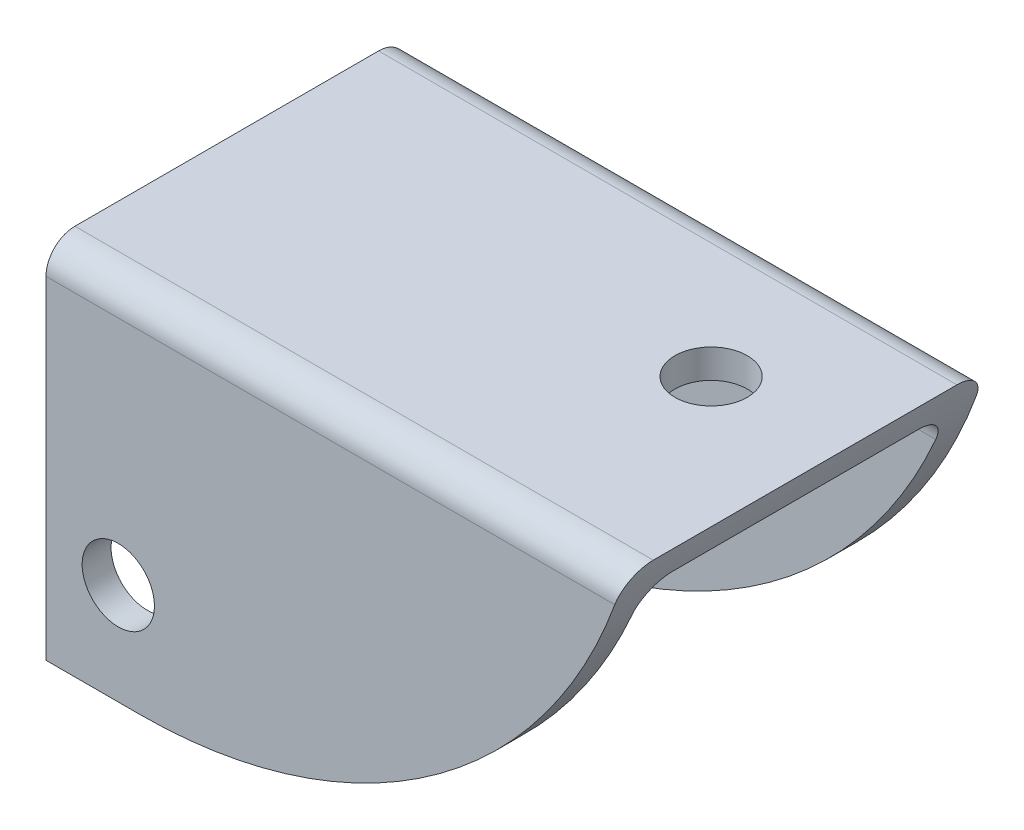
ISO-10303-21;
HEADER;
FILE_DESCRIPTION(('STEP AP214'),'2;1');
FILE_NAME('part.step','',(''),(''),'','','');
FILE_SCHEMA(('AUTOMOTIVE_DESIGN { 1 0 10303 214 1 1 1 1 }'));
ENDSEC;
DATA;
#1=APPLICATION_CONTEXT('core data for automotive mechanical design processes');
#2=APPLICATION_PROTOCOL_DEFINITION('international standard','automotive_design',2000,#1);
#3=PRODUCT_CONTEXT('',#1,'mechanical');
#4=PRODUCT('Part','Part','',(#3));
#5=PRODUCT_RELATED_PRODUCT_CATEGORY('part','',(#4));
#6=PRODUCT_DEFINITION_FORMATION('','',#4);
#7=PRODUCT_DEFINITION_CONTEXT('part definition',#1,'design');
#8=PRODUCT_DEFINITION('design','',#6,#7);
#9=PRODUCT_DEFINITION_SHAPE('','',#8);
#10=(LENGTH_UNIT() NAMED_UNIT(*) SI_UNIT(.MILLI.,.METRE.));
#11=(NAMED_UNIT(*) PLANE_ANGLE_UNIT() SI_UNIT($,.RADIAN.));
#12=(NAMED_UNIT(*) SI_UNIT($,.STERADIAN.) SOLID_ANGLE_UNIT());
#13=UNCERTAINTY_MEASURE_WITH_UNIT(LENGTH_MEASURE(1.E-05),#10,'distance_accuracy_value','');
#14=(GEOMETRIC_REPRESENTATION_CONTEXT(3) GLOBAL_UNCERTAINTY_ASSIGNED_CONTEXT((#13)) GLOBAL_UNIT_ASSIGNED_CONTEXT((#10,
#11,#12)) REPRESENTATION_CONTEXT('',''));
#15=CARTESIAN_POINT('',(0.,0.,0.));
#16=DIRECTION('',(0.,0.,1.));
#17=DIRECTION('',(1.,0.,0.));
#18=AXIS2_PLACEMENT_3D('',#15,#16,#17);
#19=CARTESIAN_POINT('',(40.,0.,-2.));
#20=DIRECTION('',(0.,1.,0.));
#21=DIRECTION('',(0.,0.,1.));
#22=AXIS2_PLACEMENT_3D('',#19,#20,#21);
#23=PLANE('',#22);
#24=DIRECTION('',(0.,0.,1.));
#25=VECTOR('',#24,1.);
#26=CARTESIAN_POINT('',(6.45898033750315,0.,-40.));
#27=LINE('',#26,#25);
#28=CARTESIAN_POINT('',(6.45898033750315,0.,-2.));
#29=VERTEX_POINT('',#28);
#30=CARTESIAN_POINT('',(6.45898033750315,0.,0.));
#31=VERTEX_POINT('',#30);
#32=EDGE_CURVE('E138',#29,#31,#27,.T.);
#33=ORIENTED_EDGE('',*,*,#32,.T.);
#34=DIRECTION('',(-1.,0.,0.));
#35=VECTOR('',#34,1.);
#36=CARTESIAN_POINT('',(40.,0.,0.));
#37=LINE('',#36,#35);
#38=CARTESIAN_POINT('',(0.,0.,0.));
#39=VERTEX_POINT('',#38);
#40=EDGE_CURVE('E150',#31,#39,#37,.T.);
#41=ORIENTED_EDGE('',*,*,#40,.T.);
#42=DIRECTION('',(0.,0.,-1.));
#43=VECTOR('',#42,1.);
#44=CARTESIAN_POINT('',(0.,0.,-2.));
#45=LINE('',#44,#43);
#46=CARTESIAN_POINT('',(0.,0.,-2.));
#47=VERTEX_POINT('',#46);
#48=EDGE_CURVE('E294',#39,#47,#45,.T.);
#49=ORIENTED_EDGE('',*,*,#48,.T.);
#50=DIRECTION('',(-1.,0.,0.));
#51=VECTOR('',#50,1.);
#52=CARTESIAN_POINT('',(40.,0.,-2.));
#53=LINE('',#52,#51);
#54=EDGE_CURVE('E152',#29,#47,#53,.T.);
#55=ORIENTED_EDGE('',*,*,#54,.F.);
#56=EDGE_LOOP('',(#33,#41,#49,#55));
#57=FACE_BOUND('',#56,.T.);
#58=ADVANCED_FACE('F39',(#57),#23,.F.);
#59=CARTESIAN_POINT('',(40.,0.,-23.));
#60=DIRECTION('',(0.,1.,0.));
#61=DIRECTION('',(0.,0.,1.));
#62=AXIS2_PLACEMENT_3D('',#59,#60,#61);
#63=PLANE('',#62);
#64=CARTESIAN_POINT('',(6.45898033750315,0.,-25.));
#65=VERTEX_POINT('',#64);
#66=CARTESIAN_POINT('',(6.45898033750315,0.,-23.));
#67=VERTEX_POINT('',#66);
#68=EDGE_CURVE('E154',#65,#67,#27,.T.);
#69=ORIENTED_EDGE('',*,*,#68,.T.);
#70=DIRECTION('',(-1.,0.,0.));
#71=VECTOR('',#70,1.);
#72=CARTESIAN_POINT('',(40.,0.,-23.));
#73=LINE('',#72,#71);
#74=CARTESIAN_POINT('',(0.,0.,-23.));
#75=VERTEX_POINT('',#74);
#76=EDGE_CURVE('E165',#67,#75,#73,.T.);
#77=ORIENTED_EDGE('',*,*,#76,.T.);
#78=DIRECTION('',(0.,0.,-1.));
#79=VECTOR('',#78,1.);
#80=CARTESIAN_POINT('',(0.,0.,-23.));
#81=LINE('',#80,#79);
#82=CARTESIAN_POINT('',(0.,0.,-25.));
#83=VERTEX_POINT('',#82);
#84=EDGE_CURVE('E321',#75,#83,#81,.T.);
#85=ORIENTED_EDGE('',*,*,#84,.T.);
#86=DIRECTION('',(-1.,0.,0.));
#87=VECTOR('',#86,1.);
#88=CARTESIAN_POINT('',(40.,0.,-25.));
#89=LINE('',#88,#87);
#90=EDGE_CURVE('E160',#65,#83,#89,.T.);
#91=ORIENTED_EDGE('',*,*,#90,.F.);
#92=EDGE_LOOP('',(#69,#77,#85,#91));
#93=FACE_BOUND('',#92,.T.);
#94=ADVANCED_FACE('F242',(#93),#63,.F.);
#95=CARTESIAN_POINT('',(40.,0.,-2.));
#96=DIRECTION('',(0.,0.,1.));
#97=DIRECTION('',(1.,0.,0.));
#98=AXIS2_PLACEMENT_3D('',#95,#96,#97);
#99=PLANE('',#98);
#100=CARTESIAN_POINT('',(5.,7.,-2.));
#101=DIRECTION('',(0.,0.,1.));
#102=DIRECTION('',(1.,0.,0.));
#103=AXIS2_PLACEMENT_3D('',#100,#101,#102);
#104=CIRCLE('',#103,2.5);
#105=CARTESIAN_POINT('',(7.5,7.,-2.));
#106=VERTEX_POINT('',#105);
#107=EDGE_CURVE('E355',#106,#106,#104,.T.);
#108=ORIENTED_EDGE('',*,*,#107,.T.);
#109=EDGE_LOOP('',(#108));
#110=FACE_BOUND('',#109,.T.);
#111=DIRECTION('',(0.,1.,0.));
#112=VECTOR('',#111,1.);
#113=CARTESIAN_POINT('',(0.,0.,-2.));
#114=LINE('',#113,#112);
#115=CARTESIAN_POINT('',(0.,21.,-2.));
#116=VERTEX_POINT('',#115);
#117=EDGE_CURVE('E289',#47,#116,#114,.T.);
#118=ORIENTED_EDGE('',*,*,#117,.T.);
#119=DIRECTION('',(-1.,0.,0.));
#120=VECTOR('',#119,1.);
#121=CARTESIAN_POINT('',(39.3375447830503,21.,-2.));
#122=LINE('',#121,#120);
#123=CARTESIAN_POINT('',(38.537010202194,21.,-2.));
#124=VERTEX_POINT('',#123);
#125=EDGE_CURVE('E61',#116,#124,#122,.F.);
#126=ORIENTED_EDGE('',*,*,#125,.T.);
#127=CARTESIAN_POINT('',(6.45898033750315,35.,-2.));
#128=DIRECTION('',(0.,0.,1.));
#129=DIRECTION('',(1.,0.,0.));
#130=AXIS2_PLACEMENT_3D('',#127,#128,#129);
#131=CIRCLE('',#130,35.);
#132=EDGE_CURVE('E300',#124,#29,#131,.F.);
#133=ORIENTED_EDGE('',*,*,#132,.T.);
#134=ORIENTED_EDGE('',*,*,#54,.T.);
#135=EDGE_LOOP('',(#118,#126,#133,#134));
#136=FACE_BOUND('',#135,.T.);
#137=ADVANCED_FACE('F247',(#110,#136),#99,.F.);
#138=CARTESIAN_POINT('',(40.,23.,-2.));
#139=DIRECTION('',(0.,1.,0.));
#140=DIRECTION('',(0.,0.,1.));
#141=AXIS2_PLACEMENT_3D('',#138,#139,#140);
#142=PLANE('',#141);
#143=CARTESIAN_POINT('',(31.,23.,-15.));
#144=DIRECTION('',(0.,1.,0.));
#145=DIRECTION('',(0.,0.,1.));
#146=AXIS2_PLACEMENT_3D('',#143,#144,#145);
#147=CIRCLE('',#146,2.5);
#148=CARTESIAN_POINT('',(31.,23.,-12.5));
#149=VERTEX_POINT('',#148);
#150=EDGE_CURVE('E145',#149,#149,#147,.T.);
#151=ORIENTED_EDGE('',*,*,#150,.T.);
#152=EDGE_LOOP('',(#151));
#153=FACE_BOUND('',#152,.T.);
#154=DIRECTION('',(0.,0.,1.));
#155=VECTOR('',#154,1.);
#156=CARTESIAN_POINT('',(39.3375447830503,23.,-40.));
#157=LINE('',#156,#155);
#158=CARTESIAN_POINT('',(39.3375447830503,23.,-21.));
#159=VERTEX_POINT('',#158);
#160=CARTESIAN_POINT('',(39.3375447830503,23.,-4.));
#161=VERTEX_POINT('',#160);
#162=EDGE_CURVE('E298',#159,#161,#157,.T.);
#163=ORIENTED_EDGE('',*,*,#162,.T.);
#164=DIRECTION('',(-1.,0.,0.));
#165=VECTOR('',#164,1.);
#166=CARTESIAN_POINT('',(0.,23.,-4.));
#167=LINE('',#166,#165);
#168=CARTESIAN_POINT('',(0.,23.,-4.));
#169=VERTEX_POINT('',#168);
#170=EDGE_CURVE('E270',#161,#169,#167,.T.);
#171=ORIENTED_EDGE('',*,*,#170,.T.);
#172=DIRECTION('',(0.,0.,-1.));
#173=VECTOR('',#172,1.);
#174=CARTESIAN_POINT('',(0.,23.,-2.));
#175=LINE('',#174,#173);
#176=CARTESIAN_POINT('',(0.,23.,-21.));
#177=VERTEX_POINT('',#176);
#178=EDGE_CURVE('E291',#169,#177,#175,.T.);
#179=ORIENTED_EDGE('',*,*,#178,.T.);
#180=DIRECTION('',(-1.,0.,0.));
#181=VECTOR('',#180,1.);
#182=CARTESIAN_POINT('',(39.3375447830503,23.,-21.));
#183=LINE('',#182,#181);
#184=EDGE_CURVE('E268',#177,#159,#183,.F.);
#185=ORIENTED_EDGE('',*,*,#184,.T.);
#186=EDGE_LOOP('',(#163,#171,#179,#185));
#187=FACE_BOUND('',#186,.T.);
#188=ADVANCED_FACE('F302',(#153,#187),#142,.F.);
#189=CARTESIAN_POINT('',(40.,23.,-23.));
#190=DIRECTION('',(0.,0.,-1.));
#191=DIRECTION('',(0.,1.,0.));
#192=AXIS2_PLACEMENT_3D('',#189,#190,#191);
#193=PLANE('',#192);
#194=CARTESIAN_POINT('',(5.,7.,-23.));
#195=DIRECTION('',(0.,0.,-1.));
#196=DIRECTION('',(0.,1.,0.));
#197=AXIS2_PLACEMENT_3D('',#194,#195,#196);
#198=CIRCLE('',#197,2.5);
#199=CARTESIAN_POINT('',(5.,9.50000000000001,-23.));
#200=VERTEX_POINT('',#199);
#201=EDGE_CURVE('E359',#200,#200,#198,.T.);
#202=ORIENTED_EDGE('',*,*,#201,.T.);
#203=EDGE_LOOP('',(#202));
#204=FACE_BOUND('',#203,.T.);
#205=CARTESIAN_POINT('',(6.45898033750315,35.,-23.));
#206=DIRECTION('',(0.,0.,-1.));
#207=DIRECTION('',(0.,1.,0.));
#208=AXIS2_PLACEMENT_3D('',#205,#206,#207);
#209=CIRCLE('',#208,35.);
#210=CARTESIAN_POINT('',(38.537010202194,21.,-23.));
#211=VERTEX_POINT('',#210);
#212=EDGE_CURVE('E305',#67,#211,#209,.F.);
#213=ORIENTED_EDGE('',*,*,#212,.T.);
#214=DIRECTION('',(-1.,0.,0.));
#215=VECTOR('',#214,1.);
#216=CARTESIAN_POINT('',(0.,21.,-23.));
#217=LINE('',#216,#215);
#218=CARTESIAN_POINT('',(0.,21.,-23.));
#219=VERTEX_POINT('',#218);
#220=EDGE_CURVE('E277',#211,#219,#217,.T.);
#221=ORIENTED_EDGE('',*,*,#220,.T.);
#222=DIRECTION('',(0.,-1.,0.));
#223=VECTOR('',#222,1.);
#224=CARTESIAN_POINT('',(0.,23.,-23.));
#225=LINE('',#224,#223);
#226=EDGE_CURVE('E318',#219,#75,#225,.T.);
#227=ORIENTED_EDGE('',*,*,#226,.T.);
#228=ORIENTED_EDGE('',*,*,#76,.F.);
#229=EDGE_LOOP('',(#213,#221,#227,#228));
#230=FACE_BOUND('',#229,.T.);
#231=ADVANCED_FACE('F343',(#204,#230),#193,.F.);
#232=CARTESIAN_POINT('',(40.,25.,-25.));
#233=DIRECTION('',(0.,0.,1.));
#234=DIRECTION('',(0.,-1.,0.));
#235=AXIS2_PLACEMENT_3D('',#232,#233,#234);
#236=PLANE('',#235);
#237=CARTESIAN_POINT('',(5.,7.,-25.));
#238=DIRECTION('',(0.,0.,1.));
#239=DIRECTION('',(1.,0.,0.));
#240=AXIS2_PLACEMENT_3D('',#237,#238,#239);
#241=CIRCLE('',#240,2.5);
#242=CARTESIAN_POINT('',(7.5,7.,-25.));
#243=VERTEX_POINT('',#242);
#244=EDGE_CURVE('E363',#243,#243,#241,.T.);
#245=ORIENTED_EDGE('',*,*,#244,.T.);
#246=EDGE_LOOP('',(#245));
#247=FACE_BOUND('',#246,.T.);
#248=DIRECTION('',(0.,1.,0.));
#249=VECTOR('',#248,1.);
#250=CARTESIAN_POINT('',(0.,25.,-25.));
#251=LINE('',#250,#249);
#252=CARTESIAN_POINT('',(0.,23.,-25.));
#253=VERTEX_POINT('',#252);
#254=EDGE_CURVE('E325',#83,#253,#251,.T.);
#255=ORIENTED_EDGE('',*,*,#254,.T.);
#256=DIRECTION('',(-1.,0.,0.));
#257=VECTOR('',#256,1.);
#258=CARTESIAN_POINT('',(40.,23.,-25.));
#259=LINE('',#258,#257);
#260=CARTESIAN_POINT('',(39.3375447830503,23.,-25.));
#261=VERTEX_POINT('',#260);
#262=EDGE_CURVE('E189',#253,#261,#259,.F.);
#263=ORIENTED_EDGE('',*,*,#262,.T.);
#264=CARTESIAN_POINT('',(6.45898033750315,35.,-25.));
#265=DIRECTION('',(0.,0.,1.));
#266=DIRECTION('',(0.,-1.,0.));
#267=AXIS2_PLACEMENT_3D('',#264,#265,#266);
#268=CIRCLE('',#267,35.);
#269=EDGE_CURVE('E310',#261,#65,#268,.F.);
#270=ORIENTED_EDGE('',*,*,#269,.T.);
#271=ORIENTED_EDGE('',*,*,#90,.T.);
#272=EDGE_LOOP('',(#255,#263,#270,#271));
#273=FACE_BOUND('',#272,.T.);
#274=ADVANCED_FACE('F338',(#247,#273),#236,.F.);
#275=CARTESIAN_POINT('',(40.,25.,0.));
#276=DIRECTION('',(0.,-1.,0.));
#277=DIRECTION('',(0.,0.,-1.));
#278=AXIS2_PLACEMENT_3D('',#275,#276,#277);
#279=PLANE('',#278);
#280=CARTESIAN_POINT('',(31.,25.,-15.));
#281=DIRECTION('',(0.,1.,0.));
#282=DIRECTION('',(0.,0.,1.));
#283=AXIS2_PLACEMENT_3D('',#280,#281,#282);
#284=CIRCLE('',#283,2.5);
#285=CARTESIAN_POINT('',(31.,25.,-12.5));
#286=VERTEX_POINT('',#285);
#287=EDGE_CURVE('E351',#286,#286,#284,.T.);
#288=ORIENTED_EDGE('',*,*,#287,.F.);
#289=EDGE_LOOP('',(#288));
#290=FACE_BOUND('',#289,.T.);
#291=DIRECTION('',(0.,0.,1.));
#292=VECTOR('',#291,1.);
#293=CARTESIAN_POINT('',(40.,25.,0.));
#294=LINE('',#293,#292);
#295=CARTESIAN_POINT('',(40.,25.,-23.));
#296=VERTEX_POINT('',#295);
#297=CARTESIAN_POINT('',(40.,25.,-2.));
#298=VERTEX_POINT('',#297);
#299=EDGE_CURVE('E161',#296,#298,#294,.T.);
#300=ORIENTED_EDGE('',*,*,#299,.F.);
#301=DIRECTION('',(-1.,0.,0.));
#302=VECTOR('',#301,1.);
#303=CARTESIAN_POINT('',(40.,25.,-23.));
#304=LINE('',#303,#302);
#305=CARTESIAN_POINT('',(0.,25.,-23.));
#306=VERTEX_POINT('',#305);
#307=EDGE_CURVE('E179',#296,#306,#304,.T.);
#308=ORIENTED_EDGE('',*,*,#307,.T.);
#309=DIRECTION('',(0.,0.,1.));
#310=VECTOR('',#309,1.);
#311=CARTESIAN_POINT('',(0.,25.,0.));
#312=LINE('',#311,#310);
#313=CARTESIAN_POINT('',(0.,25.,-2.));
#314=VERTEX_POINT('',#313);
#315=EDGE_CURVE('E328',#306,#314,#312,.T.);
#316=ORIENTED_EDGE('',*,*,#315,.T.);
#317=DIRECTION('',(-1.,0.,0.));
#318=VECTOR('',#317,1.);
#319=CARTESIAN_POINT('',(40.,25.,-2.));
#320=LINE('',#319,#318);
#321=EDGE_CURVE('E176',#314,#298,#320,.F.);
#322=ORIENTED_EDGE('',*,*,#321,.T.);
#323=EDGE_LOOP('',(#300,#308,#316,#322));
#324=FACE_BOUND('',#323,.T.);
#325=ADVANCED_FACE('F334',(#290,#324),#279,.F.);
#326=CARTESIAN_POINT('',(40.,0.,0.));
#327=DIRECTION('',(0.,0.,-1.));
#328=DIRECTION('',(0.,1.,0.));
#329=AXIS2_PLACEMENT_3D('',#326,#327,#328);
#330=PLANE('',#329);
#331=CARTESIAN_POINT('',(5.,7.,0.));
#332=DIRECTION('',(0.,0.,1.));
#333=DIRECTION('',(1.,0.,0.));
#334=AXIS2_PLACEMENT_3D('',#331,#332,#333);
#335=CIRCLE('',#334,2.5);
#336=CARTESIAN_POINT('',(7.5,7.,0.));
#337=VERTEX_POINT('',#336);
#338=EDGE_CURVE('E364',#337,#337,#335,.T.);
#339=ORIENTED_EDGE('',*,*,#338,.F.);
#340=EDGE_LOOP('',(#339));
#341=FACE_BOUND('',#340,.T.);
#342=CARTESIAN_POINT('',(6.45898033750315,35.,0.));
#343=DIRECTION('',(0.,0.,-1.));
#344=DIRECTION('',(-1.,0.,0.));
#345=AXIS2_PLACEMENT_3D('',#342,#343,#344);
#346=CIRCLE('',#345,35.);
#347=CARTESIAN_POINT('',(39.3375447830503,23.,0.));
#348=VERTEX_POINT('',#347);
#349=EDGE_CURVE('E134',#348,#31,#346,.T.);
#350=ORIENTED_EDGE('',*,*,#349,.F.);
#351=DIRECTION('',(-1.,0.,0.));
#352=VECTOR('',#351,1.);
#353=CARTESIAN_POINT('',(40.,23.,0.));
#354=LINE('',#353,#352);
#355=CARTESIAN_POINT('',(0.,23.,0.));
#356=VERTEX_POINT('',#355);
#357=EDGE_CURVE('E266',#348,#356,#354,.T.);
#358=ORIENTED_EDGE('',*,*,#357,.T.);
#359=DIRECTION('',(0.,-1.,0.));
#360=VECTOR('',#359,1.);
#361=CARTESIAN_POINT('',(0.,0.,0.));
#362=LINE('',#361,#360);
#363=EDGE_CURVE('E158',#356,#39,#362,.T.);
#364=ORIENTED_EDGE('',*,*,#363,.T.);
#365=ORIENTED_EDGE('',*,*,#40,.F.);
#366=EDGE_LOOP('',(#350,#358,#364,#365));
#367=FACE_BOUND('',#366,.T.);
#368=ADVANCED_FACE('F156',(#341,#367),#330,.F.);
#369=CARTESIAN_POINT('',(0.,0.,0.));
#370=DIRECTION('',(-1.,0.,0.));
#371=DIRECTION('',(0.,0.,1.));
#372=AXIS2_PLACEMENT_3D('',#369,#370,#371);
#373=PLANE('',#372);
#374=ORIENTED_EDGE('',*,*,#315,.F.);
#375=CARTESIAN_POINT('',(0.,23.,-23.));
#376=DIRECTION('',(-1.,0.,0.));
#377=DIRECTION('',(0.,0.,1.));
#378=AXIS2_PLACEMENT_3D('',#375,#376,#377);
#379=CIRCLE('',#378,2.);
#380=EDGE_CURVE('E186',#306,#253,#379,.T.);
#381=ORIENTED_EDGE('',*,*,#380,.T.);
#382=ORIENTED_EDGE('',*,*,#254,.F.);
#383=ORIENTED_EDGE('',*,*,#84,.F.);
#384=ORIENTED_EDGE('',*,*,#226,.F.);
#385=CARTESIAN_POINT('',(0.,21.,-21.));
#386=DIRECTION('',(-1.,0.,0.));
#387=DIRECTION('',(0.,0.,1.));
#388=AXIS2_PLACEMENT_3D('',#385,#386,#387);
#389=CIRCLE('',#388,2.);
#390=EDGE_CURVE('E54',#219,#177,#389,.F.);
#391=ORIENTED_EDGE('',*,*,#390,.T.);
#392=ORIENTED_EDGE('',*,*,#178,.F.);
#393=CARTESIAN_POINT('',(0.,21.,-4.));
#394=DIRECTION('',(-1.,0.,0.));
#395=DIRECTION('',(0.,0.,1.));
#396=AXIS2_PLACEMENT_3D('',#393,#394,#395);
#397=CIRCLE('',#396,2.);
#398=EDGE_CURVE('E227',#169,#116,#397,.F.);
#399=ORIENTED_EDGE('',*,*,#398,.T.);
#400=ORIENTED_EDGE('',*,*,#117,.F.);
#401=ORIENTED_EDGE('',*,*,#48,.F.);
#402=ORIENTED_EDGE('',*,*,#363,.F.);
#403=CARTESIAN_POINT('',(0.,23.,-2.));
#404=DIRECTION('',(-1.,0.,0.));
#405=DIRECTION('',(0.,0.,1.));
#406=AXIS2_PLACEMENT_3D('',#403,#404,#405);
#407=CIRCLE('',#406,2.);
#408=EDGE_CURVE('E183',#356,#314,#407,.T.);
#409=ORIENTED_EDGE('',*,*,#408,.T.);
#410=EDGE_LOOP('',(#374,#381,#382,#383,#384,#391,#392,#399,#400,#401,#402,#409));
#411=FACE_BOUND('',#410,.T.);
#412=ADVANCED_FACE('F213',(#411),#373,.T.);
#413=CARTESIAN_POINT('',(6.45898033750315,35.,-40.));
#414=DIRECTION('',(0.,0.,1.));
#415=DIRECTION('',(1.,0.,0.));
#416=AXIS2_PLACEMENT_3D('',#413,#414,#415);
#417=CYLINDRICAL_SURFACE('',#416,35.);
#418=ORIENTED_EDGE('',*,*,#269,.F.);
#419=CARTESIAN_POINT('',(39.3375447830503,23.,-25.));
#420=CARTESIAN_POINT('',(39.3587659845851,23.0581410754818,-24.9999976209819));
#421=CARTESIAN_POINT('',(39.3798219844198,23.1163139553572,-24.997463108197));
#422=CARTESIAN_POINT('',(39.4214895982524,23.2323843220072,-24.9873090952413));
#423=CARTESIAN_POINT('',(39.4421011399771,23.2902817628173,-24.9796887744099));
#424=CARTESIAN_POINT('',(39.5031078368754,23.4630806897511,-24.9491592175244));
#425=CARTESIAN_POINT('',(39.5426539372366,23.5770308463259,-24.9185813469403));
#426=CARTESIAN_POINT('',(39.6184250903267,23.7988830711185,-24.837328791723));
#427=CARTESIAN_POINT('',(39.654644961902,23.906775605305,-24.7866233876732));
#428=CARTESIAN_POINT('',(39.7227695095837,24.1127557654871,-24.6661281362634));
#429=CARTESIAN_POINT('',(39.754678126391,24.2108523237926,-24.5963558957264));
#430=CARTESIAN_POINT('',(39.8122757962896,24.3902759674615,-24.4424189103266));
#431=CARTESIAN_POINT('',(39.8381559000239,24.4721005631496,-24.3589059073007));
#432=CARTESIAN_POINT('',(39.8846084779659,24.6205274783758,-24.1779527395545));
#433=CARTESIAN_POINT('',(39.9051803854458,24.6871281724522,-24.0805110894708));
#434=CARTESIAN_POINT('',(39.9396474167305,24.799596515065,-23.8797909659066));
#435=CARTESIAN_POINT('',(39.9538244682456,24.8463328466505,-23.7770463148365));
#436=CARTESIAN_POINT('',(39.9766489096297,24.9219311626439,-23.5646639512818));
#437=CARTESIAN_POINT('',(39.9853032210707,24.9508155192431,-23.4550350568498));
#438=CARTESIAN_POINT('',(39.9940746904327,24.980142642448,-23.2869952843721));
#439=CARTESIAN_POINT('',(39.9962971712096,24.9875866961879,-23.2298283700234));
#440=CARTESIAN_POINT('',(39.9992583493953,24.9975121067203,-23.115117345907));
#441=CARTESIAN_POINT('',(39.9999993597098,25.0000011992864,-23.0575739650449));
#442=CARTESIAN_POINT('',(40.,25.,-23.));
#443=B_SPLINE_CURVE_WITH_KNOTS('',3,(#419,#420,#421,#422,#423,#424,#425,#426,#427,#428,#429,
#430,#431,#432,#433,#434,#435,#436,#437,#438,#439,#440,#441,#442),.UNSPECIFIED.,.F.,.F.,(4,2,2,
2,2,2,2,2,2,2,2,4),(0.,0.185571392094785,0.371172735761495,0.742558142441371,1.11451256474721,
1.48612466838324,1.84353867010159,2.2009908152439,2.54060760891599,2.87979792538323,
3.05267106434203,3.2252740983457),.UNSPECIFIED.);
#444=EDGE_CURVE('E199',#261,#296,#443,.T.);
#445=ORIENTED_EDGE('',*,*,#444,.T.);
#446=ORIENTED_EDGE('',*,*,#299,.T.);
#447=CARTESIAN_POINT('',(40.,25.,-2.));
#448=CARTESIAN_POINT('',(39.9999994527817,25.0000007912958,-1.94553170638289));
#449=CARTESIAN_POINT('',(39.9993362405888,24.9977733975958,-1.89109001163548));
#450=CARTESIAN_POINT('',(39.9966876610564,24.9888952013107,-1.78260724242139));
#451=CARTESIAN_POINT('',(39.9947024478153,24.982244914278,-1.72856612200424));
#452=CARTESIAN_POINT('',(39.9867823541081,24.9557552467168,-1.56783005148111));
#453=CARTESIAN_POINT('',(39.978882965399,24.9293766556546,-1.46223009950403));
#454=CARTESIAN_POINT('',(39.9579899768079,24.86009642108,-1.25718651534641));
#455=CARTESIAN_POINT('',(39.9449956258318,24.8171923414134,-1.15774379336237));
#456=CARTESIAN_POINT('',(39.9141568981616,24.7163269197057,-0.967625141487838));
#457=CARTESIAN_POINT('',(39.8963120353908,24.6583640686293,-0.876950091453629));
#458=CARTESIAN_POINT('',(39.855805802469,24.5282883643866,-0.705354922446679));
#459=CARTESIAN_POINT('',(39.8330747563013,24.4559721188239,-0.624605751910382));
#460=CARTESIAN_POINT('',(39.783416586498,24.3000638736045,-0.476383104623039));
#461=CARTESIAN_POINT('',(39.7564887003092,24.2164698251771,-0.408912045515397));
#462=CARTESIAN_POINT('',(39.6978332971181,24.0369756368349,-0.286242790875087));
#463=CARTESIAN_POINT('',(39.6659576009509,23.9407185379792,-0.231638662786585));
#464=CARTESIAN_POINT('',(39.5989351107703,23.7414722205314,-0.139279600067442));
#465=CARTESIAN_POINT('',(39.5637874287994,23.6384811767395,-0.101529255450972));
#466=CARTESIAN_POINT('',(39.4971290246271,23.4462453495236,-0.0483147448572359));
#467=CARTESIAN_POINT('',(39.4659983733046,23.3575956451127,-0.0301730579883233));
#468=CARTESIAN_POINT('',(39.4025529893479,23.1792505292891,-0.00601613077518691));
#469=CARTESIAN_POINT('',(39.3702404217402,23.0895572167808,2.02524026238543E-05));
#470=CARTESIAN_POINT('',(39.3375447830503,23.,0.));
#471=B_SPLINE_CURVE_WITH_KNOTS('',3,(#447,#448,#449,#450,#451,#452,#453,#454,#455,#456,#457,
#458,#459,#460,#461,#462,#463,#464,#465,#466,#467,#468,#469,#470),.UNSPECIFIED.,.F.,.F.,(4,2,2,
2,2,2,2,2,2,2,2,4),(0.,0.1633027544019,0.326586476828964,0.652288398784295,0.978038353449928,
1.3038209640287,1.63460031429667,1.96543983638407,2.30942296233613,2.65349971270886,
2.93981066013969,3.22562110667333),.UNSPECIFIED.);
#472=EDGE_CURVE('E69',#298,#348,#471,.T.);
#473=ORIENTED_EDGE('',*,*,#472,.T.);
#474=ORIENTED_EDGE('',*,*,#349,.T.);
#475=ORIENTED_EDGE('',*,*,#32,.F.);
#476=ORIENTED_EDGE('',*,*,#132,.F.);
#477=CARTESIAN_POINT('',(38.537010202194,21.,-2.));
#478=CARTESIAN_POINT('',(38.5628200004647,21.0591354265659,-2.00000332618662));
#479=CARTESIAN_POINT('',(38.5884535137311,21.1183180941536,-2.00262437868105));
#480=CARTESIAN_POINT('',(38.6392311751057,21.2364400501168,-2.01313834645702));
#481=CARTESIAN_POINT('',(38.6643752073487,21.2953792783281,-2.02103249468756));
#482=CARTESIAN_POINT('',(38.7389216559412,21.4714529443667,-2.05270794873992));
#483=CARTESIAN_POINT('',(38.7873628199948,21.5876700006295,-2.08448248404052));
#484=CARTESIAN_POINT('',(38.8803612017143,21.8140566204466,-2.16916427747466));
#485=CARTESIAN_POINT('',(38.9249107993845,21.9242141695294,-2.22211191196525));
#486=CARTESIAN_POINT('',(39.008759451401,22.1343612656652,-2.34827189143581));
#487=CARTESIAN_POINT('',(39.0480649643113,22.2343632832132,-2.42145896172497));
#488=CARTESIAN_POINT('',(39.1183276439451,22.4152490201269,-2.58194296421348));
#489=CARTESIAN_POINT('',(39.1496239346342,22.4968794469917,-2.66824869449678));
#490=CARTESIAN_POINT('',(39.205654726264,22.6443712921155,-2.85535396398799));
#491=CARTESIAN_POINT('',(39.230389057596,22.710232302774,-2.95615387772714));
#492=CARTESIAN_POINT('',(39.2710297241856,22.8191722999142,-3.1614606160542));
#493=CARTESIAN_POINT('',(39.2874422864191,22.8635472242555,-3.26518202163133));
#494=CARTESIAN_POINT('',(39.3135160190728,22.9343077840175,-3.47931112188644));
#495=CARTESIAN_POINT('',(39.3231878929833,22.9607219375847,-3.58970791239063));
#496=CARTESIAN_POINT('',(39.332091258269,22.9850664722003,-3.75096401883977));
#497=CARTESIAN_POINT('',(39.3341367375477,22.9906656163757,-3.80062355488799));
#498=CARTESIAN_POINT('',(39.3368619703463,22.998128883574,-3.90018009023379));
#499=CARTESIAN_POINT('',(39.3375438954626,22.9999989455204,-3.95007658488866));
#500=CARTESIAN_POINT('',(39.3375447830503,23.,-4.));
#501=B_SPLINE_CURVE_WITH_KNOTS('',3,(#477,#478,#479,#480,#481,#482,#483,#484,#485,#486,#487,
#488,#489,#490,#491,#492,#493,#494,#495,#496,#497,#498,#499,#500),.UNSPECIFIED.,.F.,.F.,(4,2,2,
2,2,2,2,2,2,2,2,4),(0.,0.19345726463994,0.386959779069822,0.774525274945658,1.1628333962297,
1.55065877724126,1.91726291782548,2.28387653320225,2.62417505366509,2.96393197779908,
3.11384815933258,3.26352539358526),.UNSPECIFIED.);
#502=EDGE_CURVE('E220',#124,#161,#501,.T.);
#503=ORIENTED_EDGE('',*,*,#502,.T.);
#504=ORIENTED_EDGE('',*,*,#162,.F.);
#505=CARTESIAN_POINT('',(39.3375447830503,23.,-21.));
#506=CARTESIAN_POINT('',(39.3375463347545,23.0000070062029,-21.0536660443202));
#507=CARTESIAN_POINT('',(39.3367564316867,22.9978400818116,-21.1073286799715));
#508=CARTESIAN_POINT('',(39.3336059999334,22.9892120932701,-21.2142532775811));
#509=CARTESIAN_POINT('',(39.3312457099587,22.9827516817626,-21.2675152991915));
#510=CARTESIAN_POINT('',(39.324973785518,22.96560955343,-21.3731433996478));
#511=CARTESIAN_POINT('',(39.3210656238202,22.9549372864127,-21.4255112122252));
#512=CARTESIAN_POINT('',(39.3117256667469,22.9294860634265,-21.5290856866206));
#513=CARTESIAN_POINT('',(39.3062938603887,22.9147070778556,-21.5802923400658));
#514=CARTESIAN_POINT('',(39.2877560324492,22.8644002509046,-21.7316303140214));
#515=CARTESIAN_POINT('',(39.2724017407359,22.8228863497081,-21.8295780816553));
#516=CARTESIAN_POINT('',(39.2360823270561,22.7254625597925,-22.0168292480814));
#517=CARTESIAN_POINT('',(39.2151158718924,22.6695492505429,-22.1061305859987));
#518=CARTESIAN_POINT('',(39.1675205730438,22.5438368627725,-22.2759178653229));
#519=CARTESIAN_POINT('',(39.1407755014596,22.473755013685,-22.3561617767468));
#520=CARTESIAN_POINT('',(39.0825317278437,22.3228382439344,-22.5037448921565));
#521=CARTESIAN_POINT('',(39.0510321829425,22.2420014169388,-22.5710818031847));
#522=CARTESIAN_POINT('',(38.9820312120491,22.0670775556132,-22.6951377197383));
#523=CARTESIAN_POINT('',(38.9442889332822,21.9724960840014,-22.7510244113598));
#524=CARTESIAN_POINT('',(38.8650958484269,21.7767310238236,-22.8462251681034));
#525=CARTESIAN_POINT('',(38.8236429406187,21.6755437025649,-22.8855297681184));
#526=CARTESIAN_POINT('',(38.7419493325745,21.4789008660383,-22.9442689108294));
#527=CARTESIAN_POINT('',(38.7019544002767,21.3837874157119,-22.9652113789972));
#528=CARTESIAN_POINT('',(38.6204560537613,21.192375364205,-22.9930756754227));
#529=CARTESIAN_POINT('',(38.5789556570265,21.0960793646779,-23.0000241259367));
#530=CARTESIAN_POINT('',(38.537010202194,21.,-23.));
#531=B_SPLINE_CURVE_WITH_KNOTS('',3,(#505,#506,#507,#508,#509,#510,#511,#512,#513,#514,#515,
#516,#517,#518,#519,#520,#521,#522,#523,#524,#525,#526,#527,#528,#529,#530),.UNSPECIFIED.,.F.,
.F.,(4,2,2,2,2,2,2,2,2,2,2,2,4),(0.,0.160942685987222,0.321860913047298,0.482420134576785,
0.642980513481627,0.963805274552616,1.28470631686936,1.61278946383618,1.94093084159656,
2.2879251855852,2.63511732787536,2.95002182757556,3.26432668408073),.UNSPECIFIED.);
#532=EDGE_CURVE('E11',#159,#211,#531,.T.);
#533=ORIENTED_EDGE('',*,*,#532,.T.);
#534=ORIENTED_EDGE('',*,*,#212,.F.);
#535=ORIENTED_EDGE('',*,*,#68,.F.);
#536=EDGE_LOOP('',(#418,#445,#446,#473,#474,#475,#476,#503,#504,#533,#534,#535));
#537=FACE_BOUND('',#536,.T.);
#538=ADVANCED_FACE('F137',(#537),#417,.T.);
#539=CARTESIAN_POINT('',(31.,0.,-15.));
#540=DIRECTION('',(0.,1.,0.));
#541=DIRECTION('',(0.,0.,1.));
#542=AXIS2_PLACEMENT_3D('',#539,#540,#541);
#543=CYLINDRICAL_SURFACE('',#542,2.5);
#544=ORIENTED_EDGE('',*,*,#287,.T.);
#545=EDGE_LOOP('',(#544));
#546=FACE_BOUND('',#545,.T.);
#547=ORIENTED_EDGE('',*,*,#150,.F.);
#548=EDGE_LOOP('',(#547));
#549=FACE_BOUND('',#548,.T.);
#550=ADVANCED_FACE('F212',(#546,#549),#543,.F.);
#551=CARTESIAN_POINT('',(5.,7.,-25.));
#552=DIRECTION('',(0.,0.,1.));
#553=DIRECTION('',(1.,0.,0.));
#554=AXIS2_PLACEMENT_3D('',#551,#552,#553);
#555=CYLINDRICAL_SURFACE('',#554,2.5);
#556=ORIENTED_EDGE('',*,*,#338,.T.);
#557=EDGE_LOOP('',(#556));
#558=FACE_BOUND('',#557,.T.);
#559=ORIENTED_EDGE('',*,*,#107,.F.);
#560=EDGE_LOOP('',(#559));
#561=FACE_BOUND('',#560,.T.);
#562=ADVANCED_FACE('F259',(#558,#561),#555,.F.);
#563=ORIENTED_EDGE('',*,*,#244,.F.);
#564=EDGE_LOOP('',(#563));
#565=FACE_BOUND('',#564,.T.);
#566=ORIENTED_EDGE('',*,*,#201,.F.);
#567=EDGE_LOOP('',(#566));
#568=FACE_BOUND('',#567,.T.);
#569=ADVANCED_FACE('F254',(#565,#568),#555,.F.);
#570=CARTESIAN_POINT('',(40.,23.,-23.));
#571=DIRECTION('',(-1.,0.,0.));
#572=DIRECTION('',(0.,0.,1.));
#573=AXIS2_PLACEMENT_3D('',#570,#571,#572);
#574=CYLINDRICAL_SURFACE('',#573,2.);
#575=ORIENTED_EDGE('',*,*,#444,.F.);
#576=ORIENTED_EDGE('',*,*,#262,.F.);
#577=ORIENTED_EDGE('',*,*,#380,.F.);
#578=ORIENTED_EDGE('',*,*,#307,.F.);
#579=EDGE_LOOP('',(#575,#576,#577,#578));
#580=FACE_BOUND('',#579,.T.);
#581=ADVANCED_FACE('F238',(#580),#574,.T.);
#582=CARTESIAN_POINT('',(40.,23.,-2.));
#583=DIRECTION('',(-1.,0.,0.));
#584=DIRECTION('',(0.,0.,1.));
#585=AXIS2_PLACEMENT_3D('',#582,#583,#584);
#586=CYLINDRICAL_SURFACE('',#585,2.);
#587=ORIENTED_EDGE('',*,*,#472,.F.);
#588=ORIENTED_EDGE('',*,*,#321,.F.);
#589=ORIENTED_EDGE('',*,*,#408,.F.);
#590=ORIENTED_EDGE('',*,*,#357,.F.);
#591=EDGE_LOOP('',(#587,#588,#589,#590));
#592=FACE_BOUND('',#591,.T.);
#593=ADVANCED_FACE('F206',(#592),#586,.T.);
#594=CARTESIAN_POINT('',(40.,21.,-4.));
#595=DIRECTION('',(1.,0.,0.));
#596=DIRECTION('',(0.,0.,-1.));
#597=AXIS2_PLACEMENT_3D('',#594,#595,#596);
#598=CYLINDRICAL_SURFACE('',#597,2.);
#599=ORIENTED_EDGE('',*,*,#502,.F.);
#600=ORIENTED_EDGE('',*,*,#125,.F.);
#601=ORIENTED_EDGE('',*,*,#398,.F.);
#602=ORIENTED_EDGE('',*,*,#170,.F.);
#603=EDGE_LOOP('',(#599,#600,#601,#602));
#604=FACE_BOUND('',#603,.T.);
#605=ADVANCED_FACE('F229',(#604),#598,.F.);
#606=CARTESIAN_POINT('',(40.,21.,-21.));
#607=DIRECTION('',(1.,0.,0.));
#608=DIRECTION('',(0.,0.,-1.));
#609=AXIS2_PLACEMENT_3D('',#606,#607,#608);
#610=CYLINDRICAL_SURFACE('',#609,2.);
#611=ORIENTED_EDGE('',*,*,#532,.F.);
#612=ORIENTED_EDGE('',*,*,#184,.F.);
#613=ORIENTED_EDGE('',*,*,#390,.F.);
#614=ORIENTED_EDGE('',*,*,#220,.F.);
#615=EDGE_LOOP('',(#611,#612,#613,#614));
#616=FACE_BOUND('',#615,.T.);
#617=ADVANCED_FACE('F41',(#616),#610,.F.);
#618=CLOSED_SHELL('',(#58,#94,#137,#188,#231,#274,#325,#368,#412,#538,#550,#562,#569,#581,#593,
#605,#617));
#619=MANIFOLD_SOLID_BREP('B2',#618);
#620=ADVANCED_BREP_SHAPE_REPRESENTATION('',(#18,#619),#14);
#621=SHAPE_DEFINITION_REPRESENTATION(#9,#620);
ENDSEC;
END-ISO-10303-21;
